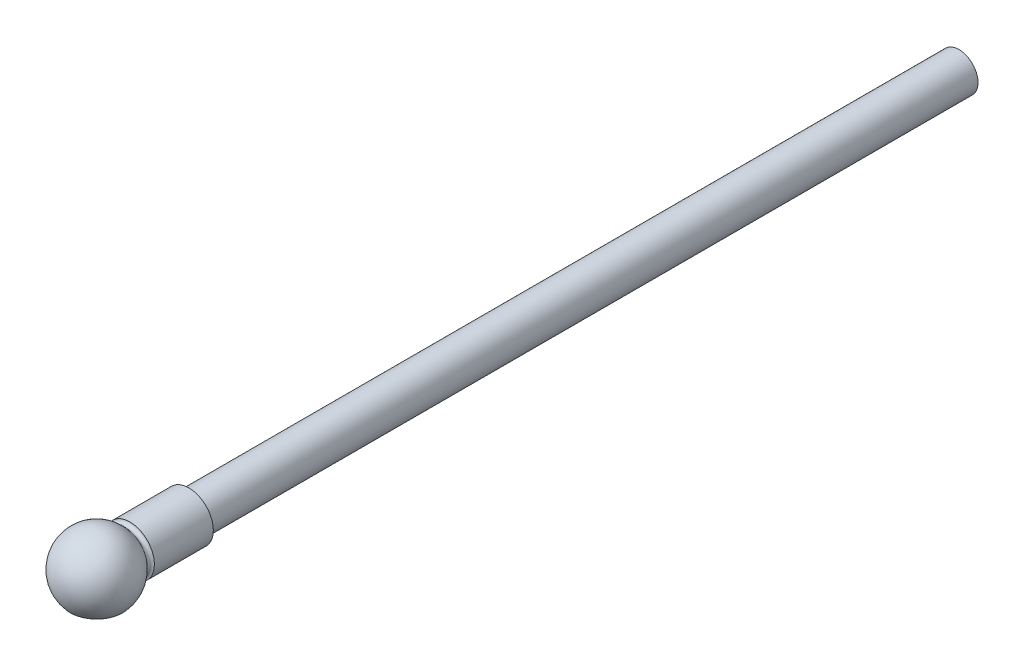
ISO-10303-21;
HEADER;
FILE_DESCRIPTION(('STEP AP214'),'2;1');
FILE_NAME('part.step','',(''),(''),'','','');
FILE_SCHEMA(('AUTOMOTIVE_DESIGN { 1 0 10303 214 1 1 1 1 }'));
ENDSEC;
DATA;
#1=APPLICATION_CONTEXT('core data for automotive mechanical design processes');
#2=APPLICATION_PROTOCOL_DEFINITION('international standard','automotive_design',2000,#1);
#3=PRODUCT_CONTEXT('',#1,'mechanical');
#4=PRODUCT('Part','Part','',(#3));
#5=PRODUCT_RELATED_PRODUCT_CATEGORY('part','',(#4));
#6=PRODUCT_DEFINITION_FORMATION('','',#4);
#7=PRODUCT_DEFINITION_CONTEXT('part definition',#1,'design');
#8=PRODUCT_DEFINITION('design','',#6,#7);
#9=PRODUCT_DEFINITION_SHAPE('','',#8);
#10=(LENGTH_UNIT() NAMED_UNIT(*) SI_UNIT(.MILLI.,.METRE.));
#11=(NAMED_UNIT(*) PLANE_ANGLE_UNIT() SI_UNIT($,.RADIAN.));
#12=(NAMED_UNIT(*) SI_UNIT($,.STERADIAN.) SOLID_ANGLE_UNIT());
#13=UNCERTAINTY_MEASURE_WITH_UNIT(LENGTH_MEASURE(1.E-05),#10,'distance_accuracy_value','');
#14=(GEOMETRIC_REPRESENTATION_CONTEXT(3) GLOBAL_UNCERTAINTY_ASSIGNED_CONTEXT((#13)) GLOBAL_UNIT_ASSIGNED_CONTEXT((#10,
#11,#12)) REPRESENTATION_CONTEXT('',''));
#15=CARTESIAN_POINT('',(0.,0.,0.));
#16=DIRECTION('',(0.,0.,1.));
#17=DIRECTION('',(1.,0.,0.));
#18=AXIS2_PLACEMENT_3D('',#15,#16,#17);
#19=CARTESIAN_POINT('',(0.,0.,193.548));
#20=DIRECTION('',(0.,1.,0.));
#21=DIRECTION('',(-1.,0.,0.));
#22=AXIS2_PLACEMENT_3D('',#19,#20,#21);
#23=SPHERICAL_SURFACE('',#22,5.00000000000032);
#24=CARTESIAN_POINT('',(0.,5.00000000000032,193.548));
#25=VERTEX_POINT('',#24);
#26=VERTEX_LOOP('',#25);
#27=FACE_BOUND('',#26,.T.);
#28=CARTESIAN_POINT('',(0.,0.,193.548));
#29=DIRECTION('',(0.,-1.,0.));
#30=DIRECTION('',(0.,0.,-1.));
#31=AXIS2_PLACEMENT_3D('',#28,#29,#30);
#32=CIRCLE('',#31,5.00000000000032);
#33=CARTESIAN_POINT('',(0.,0.,188.548));
#34=VERTEX_POINT('',#33);
#35=EDGE_CURVE('E39',#34,#34,#32,.T.);
#36=ORIENTED_EDGE('',*,*,#35,.T.);
#37=EDGE_LOOP('',(#36));
#38=FACE_BOUND('',#37,.T.);
#39=ADVANCED_FACE('F18',(#27,#38),#23,.F.);
#40=CARTESIAN_POINT('',(0.,0.,193.548));
#41=DIRECTION('',(0.,-1.,0.));
#42=DIRECTION('',(0.,0.,-1.));
#43=AXIS2_PLACEMENT_3D('',#40,#41,#42);
#44=CYLINDRICAL_SURFACE('',#43,5.00000000000032);
#45=CARTESIAN_POINT('',(0.,-5.05000000000012,193.548));
#46=DIRECTION('',(0.,-1.,0.));
#47=DIRECTION('',(0.,0.,-1.));
#48=AXIS2_PLACEMENT_3D('',#45,#46,#47);
#49=CIRCLE('',#48,5.00000000000032);
#50=CARTESIAN_POINT('',(0.,-5.05000000000012,188.548));
#51=VERTEX_POINT('',#50);
#52=EDGE_CURVE('E22',#51,#51,#49,.T.);
#53=ORIENTED_EDGE('',*,*,#52,.T.);
#54=EDGE_LOOP('',(#53));
#55=FACE_BOUND('',#54,.T.);
#56=ORIENTED_EDGE('',*,*,#35,.F.);
#57=EDGE_LOOP('',(#56));
#58=FACE_BOUND('',#57,.T.);
#59=ADVANCED_FACE('F36',(#55,#58),#44,.F.);
#60=CARTESIAN_POINT('',(0.,-5.05000000000012,198.548000000005));
#61=DIRECTION('',(0.,1.,0.));
#62=DIRECTION('',(0.,0.,1.));
#63=AXIS2_PLACEMENT_3D('',#60,#61,#62);
#64=PLANE('',#63);
#65=ORIENTED_EDGE('',*,*,#52,.F.);
#66=EDGE_LOOP('',(#65));
#67=FACE_BOUND('',#66,.T.);
#68=CARTESIAN_POINT('',(0.,-5.05000000000012,193.548));
#69=DIRECTION('',(0.,1.,0.));
#70=DIRECTION('',(0.,0.,1.));
#71=AXIS2_PLACEMENT_3D('',#68,#69,#70);
#72=CIRCLE('',#71,5.40902024400092);
#73=CARTESIAN_POINT('',(0.,-5.05000000000012,198.957020244001));
#74=VERTEX_POINT('',#73);
#75=EDGE_CURVE('E43',#74,#74,#72,.T.);
#76=ORIENTED_EDGE('',*,*,#75,.F.);
#77=EDGE_LOOP('',(#76));
#78=FACE_BOUND('',#77,.T.);
#79=ADVANCED_FACE('F60',(#67,#78),#64,.F.);
#80=CARTESIAN_POINT('',(0.,0.,193.548));
#81=DIRECTION('',(0.,1.,0.));
#82=DIRECTION('',(0.,0.,-1.));
#83=AXIS2_PLACEMENT_3D('',#80,#81,#82);
#84=SPHERICAL_SURFACE('',#83,7.40000000000088);
#85=ORIENTED_EDGE('',*,*,#75,.T.);
#86=EDGE_LOOP('',(#85));
#87=FACE_BOUND('',#86,.T.);
#88=CARTESIAN_POINT('',(0.,7.40000000000088,193.548));
#89=VERTEX_POINT('',#88);
#90=VERTEX_LOOP('',#89);
#91=FACE_BOUND('',#90,.T.);
#92=CARTESIAN_POINT('',(0.,0.,187.792210933908));
#93=DIRECTION('',(0.,0.,1.));
#94=DIRECTION('',(0.,1.,0.));
#95=AXIS2_PLACEMENT_3D('',#92,#93,#94);
#96=CIRCLE('',#95,4.6509023024219);
#97=CARTESIAN_POINT('',(0.,4.6509023024219,187.792210933908));
#98=VERTEX_POINT('',#97);
#99=EDGE_CURVE('E53',#98,#98,#96,.T.);
#100=ORIENTED_EDGE('',*,*,#99,.T.);
#101=EDGE_LOOP('',(#100));
#102=FACE_BOUND('',#101,.T.);
#103=ADVANCED_FACE('F58',(#87,#91,#102),#84,.T.);
#104=CARTESIAN_POINT('',(0.,0.,187.298302007295));
#105=DIRECTION('',(0.,0.,1.));
#106=DIRECTION('',(0.,1.,0.));
#107=AXIS2_PLACEMENT_3D('',#104,#105,#106);
#108=TOROIDAL_SURFACE('',#107,5.05000000000012,0.635);
#109=ORIENTED_EDGE('',*,*,#99,.F.);
#110=EDGE_LOOP('',(#109));
#111=FACE_BOUND('',#110,.T.);
#112=CARTESIAN_POINT('',(0.,0.,186.663302007295));
#113=DIRECTION('',(0.,0.,1.));
#114=DIRECTION('',(1.,0.,0.));
#115=AXIS2_PLACEMENT_3D('',#112,#113,#114);
#116=CIRCLE('',#115,5.05000000000012);
#117=CARTESIAN_POINT('',(5.05000000000012,0.,186.663302007295));
#118=VERTEX_POINT('',#117);
#119=EDGE_CURVE('E52',#118,#118,#116,.F.);
#120=ORIENTED_EDGE('',*,*,#119,.F.);
#121=EDGE_LOOP('',(#120));
#122=FACE_BOUND('',#121,.T.);
#123=ADVANCED_FACE('F69',(#111,#122),#108,.F.);
#124=CARTESIAN_POINT('',(0.,0.,174.498));
#125=DIRECTION('',(0.,0.,1.));
#126=DIRECTION('',(1.,0.,0.));
#127=AXIS2_PLACEMENT_3D('',#124,#125,#126);
#128=CYLINDRICAL_SURFACE('',#127,5.05000000000012);
#129=ORIENTED_EDGE('',*,*,#119,.T.);
#130=EDGE_LOOP('',(#129));
#131=FACE_BOUND('',#130,.T.);
#132=CARTESIAN_POINT('',(0.,0.,174.498));
#133=DIRECTION('',(0.,0.,1.));
#134=DIRECTION('',(1.,0.,0.));
#135=AXIS2_PLACEMENT_3D('',#132,#133,#134);
#136=CIRCLE('',#135,5.05000000000012);
#137=CARTESIAN_POINT('',(5.05000000000012,0.,174.498));
#138=VERTEX_POINT('',#137);
#139=EDGE_CURVE('E49',#138,#138,#136,.F.);
#140=ORIENTED_EDGE('',*,*,#139,.F.);
#141=EDGE_LOOP('',(#140));
#142=FACE_BOUND('',#141,.T.);
#143=ADVANCED_FACE('F88',(#131,#142),#128,.T.);
#144=CARTESIAN_POINT('',(0.,3.937,15.5600000000013));
#145=DIRECTION('',(0.,0.,-1.));
#146=DIRECTION('',(-1.,0.,0.));
#147=AXIS2_PLACEMENT_3D('',#144,#145,#146);
#148=PLANE('',#147);
#149=CARTESIAN_POINT('',(0.,0.,15.5599999999987));
#150=DIRECTION('',(0.,0.,-1.));
#151=DIRECTION('',(-1.,0.,0.));
#152=AXIS2_PLACEMENT_3D('',#149,#150,#151);
#153=CIRCLE('',#152,3.937);
#154=CARTESIAN_POINT('',(-3.937,0.,15.5599999999987));
#155=VERTEX_POINT('',#154);
#156=EDGE_CURVE('E28',#155,#155,#153,.F.);
#157=ORIENTED_EDGE('',*,*,#156,.F.);
#158=EDGE_LOOP('',(#157));
#159=FACE_BOUND('',#158,.T.);
#160=ADVANCED_FACE('F81',(#159),#148,.T.);
#161=CARTESIAN_POINT('',(0.,0.,174.498));
#162=DIRECTION('',(0.,0.,-1.));
#163=DIRECTION('',(-1.,0.,0.));
#164=AXIS2_PLACEMENT_3D('',#161,#162,#163);
#165=PLANE('',#164);
#166=CARTESIAN_POINT('',(0.,0.,174.498));
#167=DIRECTION('',(0.,0.,-1.));
#168=DIRECTION('',(-1.,0.,0.));
#169=AXIS2_PLACEMENT_3D('',#166,#167,#168);
#170=CIRCLE('',#169,3.937);
#171=CARTESIAN_POINT('',(-3.937,0.,174.498));
#172=VERTEX_POINT('',#171);
#173=EDGE_CURVE('E10',#172,#172,#170,.T.);
#174=ORIENTED_EDGE('',*,*,#173,.F.);
#175=EDGE_LOOP('',(#174));
#176=FACE_BOUND('',#175,.T.);
#177=ORIENTED_EDGE('',*,*,#139,.T.);
#178=EDGE_LOOP('',(#177));
#179=FACE_BOUND('',#178,.T.);
#180=ADVANCED_FACE('F75',(#176,#179),#165,.T.);
#181=CARTESIAN_POINT('',(0.,0.,174.498));
#182=DIRECTION('',(0.,0.,-1.));
#183=DIRECTION('',(-1.,0.,0.));
#184=AXIS2_PLACEMENT_3D('',#181,#182,#183);
#185=CYLINDRICAL_SURFACE('',#184,3.937);
#186=ORIENTED_EDGE('',*,*,#156,.T.);
#187=EDGE_LOOP('',(#186));
#188=FACE_BOUND('',#187,.T.);
#189=ORIENTED_EDGE('',*,*,#173,.T.);
#190=EDGE_LOOP('',(#189));
#191=FACE_BOUND('',#190,.T.);
#192=ADVANCED_FACE('F73',(#188,#191),#185,.T.);
#193=CLOSED_SHELL('',(#39,#59,#79,#103,#123,#143,#160,#180,#192));
#194=MANIFOLD_SOLID_BREP('B1',#193);
#195=ADVANCED_BREP_SHAPE_REPRESENTATION('',(#18,#194),#14);
#196=SHAPE_DEFINITION_REPRESENTATION(#9,#195);
ENDSEC;
END-ISO-10303-21;
